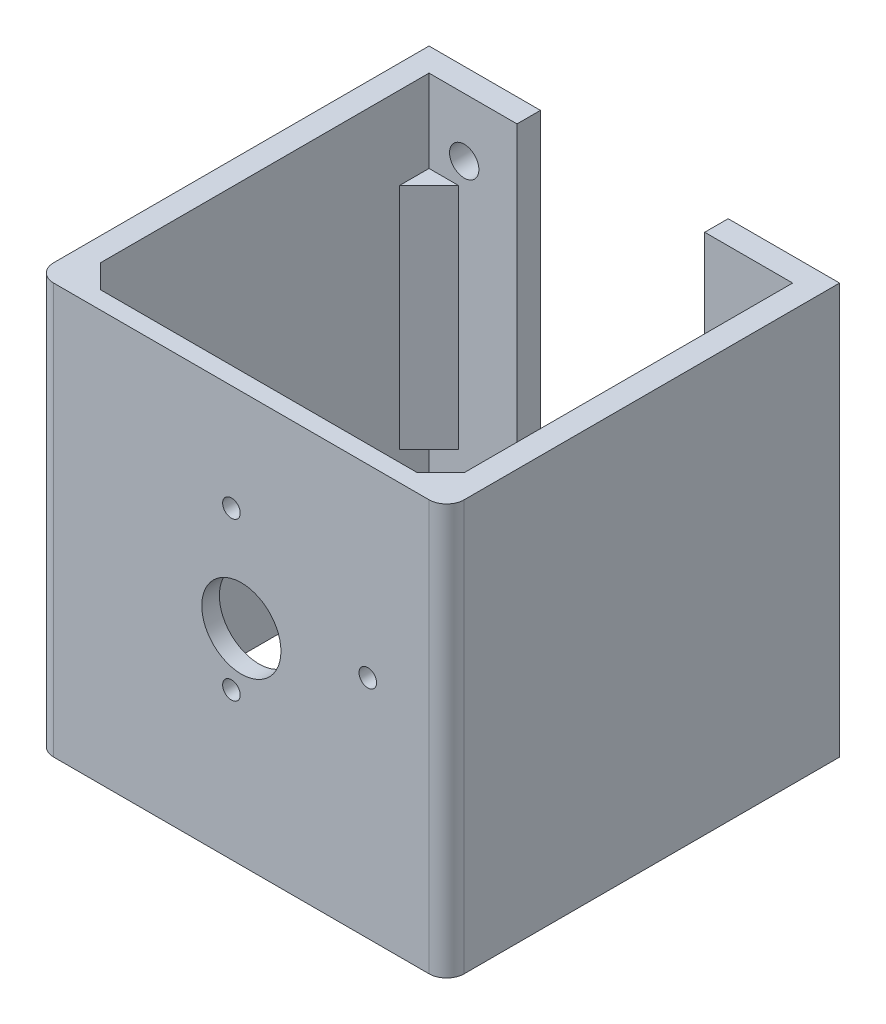
ISO-10303-21;
HEADER;
FILE_DESCRIPTION(('STEP AP214'),'2;1');
FILE_NAME('part.step','',(''),(''),'','','');
FILE_SCHEMA(('AUTOMOTIVE_DESIGN { 1 0 10303 214 1 1 1 1 }'));
ENDSEC;
DATA;
#1=APPLICATION_CONTEXT('core data for automotive mechanical design processes');
#2=APPLICATION_PROTOCOL_DEFINITION('international standard','automotive_design',2000,#1);
#3=PRODUCT_CONTEXT('',#1,'mechanical');
#4=PRODUCT('Part','Part','',(#3));
#5=PRODUCT_RELATED_PRODUCT_CATEGORY('part','',(#4));
#6=PRODUCT_DEFINITION_FORMATION('','',#4);
#7=PRODUCT_DEFINITION_CONTEXT('part definition',#1,'design');
#8=PRODUCT_DEFINITION('design','',#6,#7);
#9=PRODUCT_DEFINITION_SHAPE('','',#8);
#10=(LENGTH_UNIT() NAMED_UNIT(*) SI_UNIT(.MILLI.,.METRE.));
#11=(NAMED_UNIT(*) PLANE_ANGLE_UNIT() SI_UNIT($,.RADIAN.));
#12=(NAMED_UNIT(*) SI_UNIT($,.STERADIAN.) SOLID_ANGLE_UNIT());
#13=UNCERTAINTY_MEASURE_WITH_UNIT(LENGTH_MEASURE(1.E-05),#10,'distance_accuracy_value','');
#14=(GEOMETRIC_REPRESENTATION_CONTEXT(3) GLOBAL_UNCERTAINTY_ASSIGNED_CONTEXT((#13)) GLOBAL_UNIT_ASSIGNED_CONTEXT((#10,
#11,#12)) REPRESENTATION_CONTEXT('',''));
#15=CARTESIAN_POINT('',(0.,0.,0.));
#16=DIRECTION('',(0.,0.,1.));
#17=DIRECTION('',(1.,0.,0.));
#18=AXIS2_PLACEMENT_3D('',#15,#16,#17);
#19=CARTESIAN_POINT('',(21.3942475766725,0.,0.));
#20=DIRECTION('',(-1.,0.,0.));
#21=DIRECTION('',(0.,-1.,0.));
#22=AXIS2_PLACEMENT_3D('',#19,#20,#21);
#23=PLANE('',#22);
#24=DIRECTION('',(0.,1.,0.));
#25=VECTOR('',#24,1.);
#26=CARTESIAN_POINT('',(21.3942475766725,-19.,-55.0000000000001));
#27=LINE('',#26,#25);
#28=CARTESIAN_POINT('',(21.3942475766725,-19.,-55.0000000000001));
#29=VERTEX_POINT('',#28);
#30=CARTESIAN_POINT('',(21.3942475766725,20.,-55.0000000000001));
#31=VERTEX_POINT('',#30);
#32=EDGE_CURVE('E195',#29,#31,#27,.T.);
#33=ORIENTED_EDGE('',*,*,#32,.F.);
#34=DIRECTION('',(0.,0.,-1.));
#35=VECTOR('',#34,1.);
#36=CARTESIAN_POINT('',(21.3942475766725,-19.,-55.0000000000001));
#37=LINE('',#36,#35);
#38=CARTESIAN_POINT('',(21.3942475766725,-19.,-60.));
#39=VERTEX_POINT('',#38);
#40=EDGE_CURVE('E207',#29,#39,#37,.T.);
#41=ORIENTED_EDGE('',*,*,#40,.T.);
#42=DIRECTION('',(0.,-1.,0.));
#43=VECTOR('',#42,1.);
#44=CARTESIAN_POINT('',(21.3942475766725,-35.9180041315748,-60.));
#45=LINE('',#44,#43);
#46=CARTESIAN_POINT('',(21.3942475766725,-35.9180041315748,-60.));
#47=VERTEX_POINT('',#46);
#48=EDGE_CURVE('E306',#39,#47,#45,.T.);
#49=ORIENTED_EDGE('',*,*,#48,.T.);
#50=DIRECTION('',(0.,0.,-1.));
#51=VECTOR('',#50,1.);
#52=CARTESIAN_POINT('',(21.3942475766725,-35.9180041315748,-64.));
#53=LINE('',#52,#51);
#54=CARTESIAN_POINT('',(21.3942475766725,-35.9180041315748,-4.));
#55=VERTEX_POINT('',#54);
#56=EDGE_CURVE('E339',#55,#47,#53,.T.);
#57=ORIENTED_EDGE('',*,*,#56,.F.);
#58=DIRECTION('',(0.,1.,0.));
#59=VECTOR('',#58,1.);
#60=CARTESIAN_POINT('',(21.3942475766725,-35.9180041315748,-4.));
#61=LINE('',#60,#59);
#62=CARTESIAN_POINT('',(21.3942475766725,34.0819958684253,-4.));
#63=VERTEX_POINT('',#62);
#64=EDGE_CURVE('E239',#55,#63,#61,.T.);
#65=ORIENTED_EDGE('',*,*,#64,.T.);
#66=DIRECTION('',(0.,0.,1.));
#67=VECTOR('',#66,1.);
#68=CARTESIAN_POINT('',(21.3942475766725,34.0819958684253,0.));
#69=LINE('',#68,#67);
#70=CARTESIAN_POINT('',(21.3942475766725,34.0819958684253,-60.));
#71=VERTEX_POINT('',#70);
#72=EDGE_CURVE('E342',#71,#63,#69,.T.);
#73=ORIENTED_EDGE('',*,*,#72,.F.);
#74=CARTESIAN_POINT('',(21.3942475766725,20.,-60.));
#75=VERTEX_POINT('',#74);
#76=EDGE_CURVE('E303',#71,#75,#45,.T.);
#77=ORIENTED_EDGE('',*,*,#76,.T.);
#78=DIRECTION('',(0.,0.,-1.));
#79=VECTOR('',#78,1.);
#80=CARTESIAN_POINT('',(21.3942475766725,20.,-55.0000000000001));
#81=LINE('',#80,#79);
#82=EDGE_CURVE('E203',#31,#75,#81,.T.);
#83=ORIENTED_EDGE('',*,*,#82,.F.);
#84=EDGE_LOOP('',(#33,#41,#49,#57,#65,#73,#77,#83));
#85=FACE_BOUND('',#84,.T.);
#86=ADVANCED_FACE('F35',(#85),#23,.T.);
#87=CARTESIAN_POINT('',(0.,0.,-60.));
#88=DIRECTION('',(0.,0.,1.));
#89=DIRECTION('',(1.,0.,0.));
#90=AXIS2_PLACEMENT_3D('',#87,#88,#89);
#91=PLANE('',#90);
#92=CARTESIAN_POINT('',(15.3942475766725,-25.9180041315748,-60.));
#93=DIRECTION('',(0.,0.,-1.));
#94=DIRECTION('',(-1.,0.,0.));
#95=AXIS2_PLACEMENT_3D('',#92,#93,#94);
#96=CIRCLE('',#95,2.5);
#97=CARTESIAN_POINT('',(12.8942475766725,-25.9180041315748,-60.));
#98=VERTEX_POINT('',#97);
#99=EDGE_CURVE('E263',#98,#98,#96,.T.);
#100=ORIENTED_EDGE('',*,*,#99,.T.);
#101=EDGE_LOOP('',(#100));
#102=FACE_BOUND('',#101,.T.);
#103=CARTESIAN_POINT('',(15.3942475766725,24.0819958684252,-60.));
#104=DIRECTION('',(0.,0.,-1.));
#105=DIRECTION('',(-1.,0.,0.));
#106=AXIS2_PLACEMENT_3D('',#103,#104,#105);
#107=CIRCLE('',#106,2.5);
#108=CARTESIAN_POINT('',(12.8942475766725,24.0819958684252,-60.));
#109=VERTEX_POINT('',#108);
#110=EDGE_CURVE('E275',#109,#109,#107,.T.);
#111=ORIENTED_EDGE('',*,*,#110,.T.);
#112=EDGE_LOOP('',(#111));
#113=FACE_BOUND('',#112,.T.);
#114=ORIENTED_EDGE('',*,*,#48,.F.);
#115=DIRECTION('',(-1.,0.,0.));
#116=VECTOR('',#115,1.);
#117=CARTESIAN_POINT('',(21.3942475766725,-19.,-60.));
#118=LINE('',#117,#116);
#119=CARTESIAN_POINT('',(16.3942475766725,-19.,-60.));
#120=VERTEX_POINT('',#119);
#121=EDGE_CURVE('E190',#39,#120,#118,.T.);
#122=ORIENTED_EDGE('',*,*,#121,.T.);
#123=DIRECTION('',(0.,1.,0.));
#124=VECTOR('',#123,1.);
#125=CARTESIAN_POINT('',(16.3942475766725,-19.,-60.));
#126=LINE('',#125,#124);
#127=CARTESIAN_POINT('',(16.3942475766725,20.,-60.));
#128=VERTEX_POINT('',#127);
#129=EDGE_CURVE('E183',#120,#128,#126,.T.);
#130=ORIENTED_EDGE('',*,*,#129,.T.);
#131=DIRECTION('',(-1.,0.,0.));
#132=VECTOR('',#131,1.);
#133=CARTESIAN_POINT('',(21.3942475766725,20.,-60.));
#134=LINE('',#133,#132);
#135=EDGE_CURVE('E187',#75,#128,#134,.T.);
#136=ORIENTED_EDGE('',*,*,#135,.F.);
#137=ORIENTED_EDGE('',*,*,#76,.F.);
#138=DIRECTION('',(1.,0.,0.));
#139=VECTOR('',#138,1.);
#140=CARTESIAN_POINT('',(21.3942475766725,34.0819958684253,-60.));
#141=LINE('',#140,#139);
#142=CARTESIAN_POINT('',(6.39424757667248,34.0819958684253,-60.));
#143=VERTEX_POINT('',#142);
#144=EDGE_CURVE('E312',#143,#71,#141,.T.);
#145=ORIENTED_EDGE('',*,*,#144,.F.);
#146=DIRECTION('',(0.,1.,0.));
#147=VECTOR('',#146,1.);
#148=CARTESIAN_POINT('',(6.39424757667248,34.0819958684253,-60.));
#149=LINE('',#148,#147);
#150=CARTESIAN_POINT('',(6.39424757667248,-35.9180041315748,-60.));
#151=VERTEX_POINT('',#150);
#152=EDGE_CURVE('E309',#151,#143,#149,.T.);
#153=ORIENTED_EDGE('',*,*,#152,.F.);
#154=DIRECTION('',(-1.,0.,0.));
#155=VECTOR('',#154,1.);
#156=CARTESIAN_POINT('',(6.39424757667248,-35.9180041315748,-60.));
#157=LINE('',#156,#155);
#158=EDGE_CURVE('E305',#47,#151,#157,.T.);
#159=ORIENTED_EDGE('',*,*,#158,.F.);
#160=EDGE_LOOP('',(#114,#122,#130,#136,#137,#145,#153,#159));
#161=FACE_BOUND('',#160,.T.);
#162=ADVANCED_FACE('F186',(#102,#113,#161),#91,.T.);
#163=CARTESIAN_POINT('',(-40.6057524233275,0.,0.));
#164=DIRECTION('',(-1.,0.,0.));
#165=DIRECTION('',(0.,-1.,0.));
#166=AXIS2_PLACEMENT_3D('',#163,#164,#165);
#167=PLANE('',#166);
#168=DIRECTION('',(0.,1.,0.));
#169=VECTOR('',#168,1.);
#170=CARTESIAN_POINT('',(-40.6057524233275,-35.9180041315748,-60.));
#171=LINE('',#170,#169);
#172=CARTESIAN_POINT('',(-40.6057524233275,-35.9180041315748,-60.));
#173=VERTEX_POINT('',#172);
#174=CARTESIAN_POINT('',(-40.6057524233275,-19.,-60.));
#175=VERTEX_POINT('',#174);
#176=EDGE_CURVE('E281',#173,#175,#171,.T.);
#177=ORIENTED_EDGE('',*,*,#176,.T.);
#178=DIRECTION('',(0.,0.,1.));
#179=VECTOR('',#178,1.);
#180=CARTESIAN_POINT('',(-40.6057524233275,-19.,-54.9999999999999));
#181=LINE('',#180,#179);
#182=CARTESIAN_POINT('',(-40.6057524233275,-19.,-54.9999999999999));
#183=VERTEX_POINT('',#182);
#184=EDGE_CURVE('E224',#175,#183,#181,.T.);
#185=ORIENTED_EDGE('',*,*,#184,.T.);
#186=DIRECTION('',(0.,1.,0.));
#187=VECTOR('',#186,1.);
#188=CARTESIAN_POINT('',(-40.6057524233275,-19.,-54.9999999999999));
#189=LINE('',#188,#187);
#190=CARTESIAN_POINT('',(-40.6057524233275,20.,-54.9999999999999));
#191=VERTEX_POINT('',#190);
#192=EDGE_CURVE('E231',#183,#191,#189,.T.);
#193=ORIENTED_EDGE('',*,*,#192,.T.);
#194=DIRECTION('',(0.,0.,1.));
#195=VECTOR('',#194,1.);
#196=CARTESIAN_POINT('',(-40.6057524233275,20.,-54.9999999999999));
#197=LINE('',#196,#195);
#198=CARTESIAN_POINT('',(-40.6057524233275,20.,-60.));
#199=VERTEX_POINT('',#198);
#200=EDGE_CURVE('E214',#199,#191,#197,.T.);
#201=ORIENTED_EDGE('',*,*,#200,.F.);
#202=CARTESIAN_POINT('',(-40.6057524233275,34.0819958684252,-60.));
#203=VERTEX_POINT('',#202);
#204=EDGE_CURVE('E285',#199,#203,#171,.T.);
#205=ORIENTED_EDGE('',*,*,#204,.T.);
#206=DIRECTION('',(0.,0.,-1.));
#207=VECTOR('',#206,1.);
#208=CARTESIAN_POINT('',(-40.6057524233275,34.0819958684253,0.));
#209=LINE('',#208,#207);
#210=CARTESIAN_POINT('',(-40.6057524233275,34.0819958684253,-4.));
#211=VERTEX_POINT('',#210);
#212=EDGE_CURVE('E324',#211,#203,#209,.T.);
#213=ORIENTED_EDGE('',*,*,#212,.F.);
#214=DIRECTION('',(0.,1.,0.));
#215=VECTOR('',#214,1.);
#216=CARTESIAN_POINT('',(-40.6057524233275,-35.9180041315748,-4.));
#217=LINE('',#216,#215);
#218=CARTESIAN_POINT('',(-40.6057524233275,-35.9180041315748,-4.));
#219=VERTEX_POINT('',#218);
#220=EDGE_CURVE('E251',#219,#211,#217,.T.);
#221=ORIENTED_EDGE('',*,*,#220,.F.);
#222=DIRECTION('',(0.,0.,1.));
#223=VECTOR('',#222,1.);
#224=CARTESIAN_POINT('',(-40.6057524233275,-35.9180041315748,-64.));
#225=LINE('',#224,#223);
#226=EDGE_CURVE('E327',#173,#219,#225,.T.);
#227=ORIENTED_EDGE('',*,*,#226,.F.);
#228=EDGE_LOOP('',(#177,#185,#193,#201,#205,#213,#221,#227));
#229=FACE_BOUND('',#228,.T.);
#230=ADVANCED_FACE('F447',(#229),#167,.F.);
#231=CARTESIAN_POINT('',(0.,0.,0.));
#232=DIRECTION('',(0.,0.,1.));
#233=DIRECTION('',(1.,0.,0.));
#234=AXIS2_PLACEMENT_3D('',#231,#232,#233);
#235=PLANE('',#234);
#236=CARTESIAN_POINT('',(-9.6057524233275,-0.918004131574765,0.));
#237=DIRECTION('',(0.,0.,1.));
#238=DIRECTION('',(1.,0.,0.));
#239=AXIS2_PLACEMENT_3D('',#236,#237,#238);
#240=CIRCLE('',#239,6.75);
#241=CARTESIAN_POINT('',(-2.8557524233275,-0.918004131574765,0.));
#242=VERTEX_POINT('',#241);
#243=EDGE_CURVE('E365',#242,#242,#240,.T.);
#244=ORIENTED_EDGE('',*,*,#243,.T.);
#245=EDGE_LOOP('',(#244));
#246=FACE_BOUND('',#245,.T.);
#247=CARTESIAN_POINT('',(-11.2935745968364,16.005389627084,0.));
#248=DIRECTION('',(0.,0.,1.));
#249=DIRECTION('',(1.,0.,0.));
#250=AXIS2_PLACEMENT_3D('',#247,#248,#249);
#251=CIRCLE('',#250,1.5);
#252=CARTESIAN_POINT('',(-9.79357459683639,16.005389627084,0.));
#253=VERTEX_POINT('',#252);
#254=EDGE_CURVE('E389',#253,#253,#251,.T.);
#255=ORIENTED_EDGE('',*,*,#254,.T.);
#256=EDGE_LOOP('',(#255));
#257=FACE_BOUND('',#256,.T.);
#258=CARTESIAN_POINT('',(11.9564254031636,2.5819958684252,0.));
#259=DIRECTION('',(0.,0.,1.));
#260=DIRECTION('',(1.,0.,0.));
#261=AXIS2_PLACEMENT_3D('',#258,#259,#260);
#262=CIRCLE('',#261,1.5);
#263=CARTESIAN_POINT('',(13.4564254031636,2.5819958684252,0.));
#264=VERTEX_POINT('',#263);
#265=EDGE_CURVE('E392',#264,#264,#262,.T.);
#266=ORIENTED_EDGE('',*,*,#265,.T.);
#267=EDGE_LOOP('',(#266));
#268=FACE_BOUND('',#267,.T.);
#269=CARTESIAN_POINT('',(-11.2935745968364,-10.8413978902336,0.));
#270=DIRECTION('',(0.,0.,1.));
#271=DIRECTION('',(1.,0.,0.));
#272=AXIS2_PLACEMENT_3D('',#269,#270,#271);
#273=CIRCLE('',#272,1.5);
#274=CARTESIAN_POINT('',(-9.79357459683645,-10.8413978902336,0.));
#275=VERTEX_POINT('',#274);
#276=EDGE_CURVE('E377',#275,#275,#273,.T.);
#277=ORIENTED_EDGE('',*,*,#276,.T.);
#278=EDGE_LOOP('',(#277));
#279=FACE_BOUND('',#278,.T.);
#280=DIRECTION('',(-1.,0.,0.));
#281=VECTOR('',#280,1.);
#282=CARTESIAN_POINT('',(-44.6057524233275,34.0819958684253,0.));
#283=LINE('',#282,#281);
#284=CARTESIAN_POINT('',(17.3942475766725,34.0819958684253,0.));
#285=VERTEX_POINT('',#284);
#286=CARTESIAN_POINT('',(-36.6057524233275,34.0819958684253,0.));
#287=VERTEX_POINT('',#286);
#288=EDGE_CURVE('E370',#285,#287,#283,.T.);
#289=ORIENTED_EDGE('',*,*,#288,.F.);
#290=DIRECTION('',(0.,1.,0.));
#291=VECTOR('',#290,1.);
#292=CARTESIAN_POINT('',(17.3942475766725,-35.9180041315748,0.));
#293=LINE('',#292,#291);
#294=CARTESIAN_POINT('',(17.3942475766725,-35.9180041315748,0.));
#295=VERTEX_POINT('',#294);
#296=EDGE_CURVE('E242',#295,#285,#293,.T.);
#297=ORIENTED_EDGE('',*,*,#296,.F.);
#298=DIRECTION('',(1.,0.,0.));
#299=VECTOR('',#298,1.);
#300=CARTESIAN_POINT('',(-44.6057524233275,-35.9180041315748,0.));
#301=LINE('',#300,#299);
#302=CARTESIAN_POINT('',(-36.6057524233275,-35.9180041315748,0.));
#303=VERTEX_POINT('',#302);
#304=EDGE_CURVE('E374',#303,#295,#301,.T.);
#305=ORIENTED_EDGE('',*,*,#304,.F.);
#306=DIRECTION('',(0.,1.,0.));
#307=VECTOR('',#306,1.);
#308=CARTESIAN_POINT('',(-36.6057524233275,-35.9180041315748,0.));
#309=LINE('',#308,#307);
#310=EDGE_CURVE('E249',#303,#287,#309,.T.);
#311=ORIENTED_EDGE('',*,*,#310,.T.);
#312=EDGE_LOOP('',(#289,#297,#305,#311));
#313=FACE_BOUND('',#312,.T.);
#314=ADVANCED_FACE('F439',(#246,#257,#268,#279,#313),#235,.F.);
#315=CARTESIAN_POINT('',(-44.6057524233275,34.0819958684253,3.));
#316=DIRECTION('',(1.,0.,0.));
#317=DIRECTION('',(0.,1.,0.));
#318=AXIS2_PLACEMENT_3D('',#315,#316,#317);
#319=PLANE('',#318);
#320=DIRECTION('',(0.,0.,-1.));
#321=VECTOR('',#320,1.);
#322=CARTESIAN_POINT('',(-44.6057524233275,-35.9180041315748,3.));
#323=LINE('',#322,#321);
#324=CARTESIAN_POINT('',(-44.6057524233275,-35.9180041315748,0.));
#325=VERTEX_POINT('',#324);
#326=CARTESIAN_POINT('',(-44.6057524233275,-35.9180041315748,-64.));
#327=VERTEX_POINT('',#326);
#328=EDGE_CURVE('E384',#325,#327,#323,.T.);
#329=ORIENTED_EDGE('',*,*,#328,.F.);
#330=DIRECTION('',(0.,-1.,0.));
#331=VECTOR('',#330,1.);
#332=CARTESIAN_POINT('',(-44.6057524233275,34.0819958684253,0.));
#333=LINE('',#332,#331);
#334=CARTESIAN_POINT('',(-44.6057524233275,34.0819958684253,0.));
#335=VERTEX_POINT('',#334);
#336=EDGE_CURVE('E11',#325,#335,#333,.F.);
#337=ORIENTED_EDGE('',*,*,#336,.T.);
#338=DIRECTION('',(0.,0.,-1.));
#339=VECTOR('',#338,1.);
#340=CARTESIAN_POINT('',(-44.6057524233275,34.0819958684253,3.));
#341=LINE('',#340,#339);
#342=CARTESIAN_POINT('',(-44.6057524233275,34.0819958684252,-64.));
#343=VERTEX_POINT('',#342);
#344=EDGE_CURVE('E373',#335,#343,#341,.T.);
#345=ORIENTED_EDGE('',*,*,#344,.T.);
#346=DIRECTION('',(0.,-1.,0.));
#347=VECTOR('',#346,1.);
#348=CARTESIAN_POINT('',(-44.6057524233275,34.0819958684252,-64.));
#349=LINE('',#348,#347);
#350=EDGE_CURVE('E321',#343,#327,#349,.T.);
#351=ORIENTED_EDGE('',*,*,#350,.T.);
#352=EDGE_LOOP('',(#329,#337,#345,#351));
#353=FACE_BOUND('',#352,.T.);
#354=ADVANCED_FACE('F463',(#353),#319,.F.);
#355=CARTESIAN_POINT('',(-44.6057524233275,-35.9180041315748,3.));
#356=DIRECTION('',(0.,1.,0.));
#357=DIRECTION('',(0.,0.,1.));
#358=AXIS2_PLACEMENT_3D('',#355,#356,#357);
#359=PLANE('',#358);
#360=DIRECTION('',(0.,0.,-1.));
#361=VECTOR('',#360,1.);
#362=CARTESIAN_POINT('',(25.3942475766725,-35.9180041315748,3.));
#363=LINE('',#362,#361);
#364=CARTESIAN_POINT('',(25.3942475766725,-35.9180041315748,0.));
#365=VERTEX_POINT('',#364);
#366=CARTESIAN_POINT('',(25.3942475766725,-35.9180041315748,-64.));
#367=VERTEX_POINT('',#366);
#368=EDGE_CURVE('E382',#365,#367,#363,.T.);
#369=ORIENTED_EDGE('',*,*,#368,.F.);
#370=CARTESIAN_POINT('',(22.3942475766725,-35.9180041315748,0.));
#371=DIRECTION('',(0.,1.,0.));
#372=DIRECTION('',(0.,0.,1.));
#373=AXIS2_PLACEMENT_3D('',#370,#371,#372);
#374=CIRCLE('',#373,3.);
#375=CARTESIAN_POINT('',(22.3942475766725,-35.9180041315748,3.));
#376=VERTEX_POINT('',#375);
#377=EDGE_CURVE('E43',#365,#376,#374,.F.);
#378=ORIENTED_EDGE('',*,*,#377,.T.);
#379=DIRECTION('',(1.,0.,0.));
#380=VECTOR('',#379,1.);
#381=CARTESIAN_POINT('',(-44.6057524233275,-35.9180041315748,3.));
#382=LINE('',#381,#380);
#383=CARTESIAN_POINT('',(-41.6057524233275,-35.9180041315748,3.));
#384=VERTEX_POINT('',#383);
#385=EDGE_CURVE('E366',#384,#376,#382,.T.);
#386=ORIENTED_EDGE('',*,*,#385,.F.);
#387=CARTESIAN_POINT('',(-41.6057524233275,-35.9180041315748,0.));
#388=DIRECTION('',(0.,1.,0.));
#389=DIRECTION('',(0.,0.,1.));
#390=AXIS2_PLACEMENT_3D('',#387,#388,#389);
#391=CIRCLE('',#390,3.);
#392=EDGE_CURVE('E50',#384,#325,#391,.F.);
#393=ORIENTED_EDGE('',*,*,#392,.T.);
#394=ORIENTED_EDGE('',*,*,#328,.T.);
#395=DIRECTION('',(-1.,0.,0.));
#396=VECTOR('',#395,1.);
#397=CARTESIAN_POINT('',(-40.6057524233275,-35.9180041315748,-64.));
#398=LINE('',#397,#396);
#399=CARTESIAN_POINT('',(-25.6057524233275,-35.9180041315748,-64.));
#400=VERTEX_POINT('',#399);
#401=EDGE_CURVE('E333',#400,#327,#398,.T.);
#402=ORIENTED_EDGE('',*,*,#401,.F.);
#403=DIRECTION('',(0.,0.,-1.));
#404=VECTOR('',#403,1.);
#405=CARTESIAN_POINT('',(-25.6057524233275,-35.9180041315748,-60.));
#406=LINE('',#405,#404);
#407=CARTESIAN_POINT('',(-25.6057524233275,-35.9180041315748,-60.));
#408=VERTEX_POINT('',#407);
#409=EDGE_CURVE('E297',#408,#400,#406,.T.);
#410=ORIENTED_EDGE('',*,*,#409,.F.);
#411=DIRECTION('',(-1.,0.,0.));
#412=VECTOR('',#411,1.);
#413=CARTESIAN_POINT('',(-25.6057524233275,-35.9180041315748,-60.));
#414=LINE('',#413,#412);
#415=EDGE_CURVE('E291',#408,#173,#414,.T.);
#416=ORIENTED_EDGE('',*,*,#415,.T.);
#417=ORIENTED_EDGE('',*,*,#226,.T.);
#418=DIRECTION('',(-0.707106781186548,0.,-0.707106781186547));
#419=VECTOR('',#418,1.);
#420=CARTESIAN_POINT('',(-40.6057524233275,-35.9180041315748,-4.));
#421=LINE('',#420,#419);
#422=EDGE_CURVE('E247',#303,#219,#421,.T.);
#423=ORIENTED_EDGE('',*,*,#422,.F.);
#424=ORIENTED_EDGE('',*,*,#304,.T.);
#425=DIRECTION('',(-0.707106781186547,0.,0.707106781186548));
#426=VECTOR('',#425,1.);
#427=CARTESIAN_POINT('',(21.3942475766725,-35.9180041315748,-4.));
#428=LINE('',#427,#426);
#429=EDGE_CURVE('E237',#55,#295,#428,.T.);
#430=ORIENTED_EDGE('',*,*,#429,.F.);
#431=ORIENTED_EDGE('',*,*,#56,.T.);
#432=ORIENTED_EDGE('',*,*,#158,.T.);
#433=DIRECTION('',(0.,0.,-1.));
#434=VECTOR('',#433,1.);
#435=CARTESIAN_POINT('',(6.39424757667248,-35.9180041315748,-60.));
#436=LINE('',#435,#434);
#437=CARTESIAN_POINT('',(6.39424757667248,-35.9180041315748,-64.));
#438=VERTEX_POINT('',#437);
#439=EDGE_CURVE('E315',#151,#438,#436,.T.);
#440=ORIENTED_EDGE('',*,*,#439,.T.);
#441=DIRECTION('',(1.,0.,0.));
#442=VECTOR('',#441,1.);
#443=CARTESIAN_POINT('',(21.3942475766725,-35.9180041315748,-64.));
#444=LINE('',#443,#442);
#445=EDGE_CURVE('E345',#438,#367,#444,.T.);
#446=ORIENTED_EDGE('',*,*,#445,.T.);
#447=EDGE_LOOP('',(#369,#378,#386,#393,#394,#402,#410,#416,#417,#423,#424,#430,#431,#432,#440,#446));
#448=FACE_BOUND('',#447,.T.);
#449=ADVANCED_FACE('F408',(#448),#359,.F.);
#450=CARTESIAN_POINT('',(25.3942475766725,34.0819958684253,3.));
#451=DIRECTION('',(-1.,0.,0.));
#452=DIRECTION('',(0.,-1.,0.));
#453=AXIS2_PLACEMENT_3D('',#450,#451,#452);
#454=PLANE('',#453);
#455=DIRECTION('',(0.,0.,-1.));
#456=VECTOR('',#455,1.);
#457=CARTESIAN_POINT('',(25.3942475766725,34.0819958684253,3.));
#458=LINE('',#457,#456);
#459=CARTESIAN_POINT('',(25.3942475766725,34.0819958684253,0.));
#460=VERTEX_POINT('',#459);
#461=CARTESIAN_POINT('',(25.3942475766725,34.0819958684253,-64.));
#462=VERTEX_POINT('',#461);
#463=EDGE_CURVE('E380',#460,#462,#458,.T.);
#464=ORIENTED_EDGE('',*,*,#463,.F.);
#465=DIRECTION('',(0.,1.,0.));
#466=VECTOR('',#465,1.);
#467=CARTESIAN_POINT('',(25.3942475766725,-35.9180041315748,0.));
#468=LINE('',#467,#466);
#469=EDGE_CURVE('E58',#460,#365,#468,.F.);
#470=ORIENTED_EDGE('',*,*,#469,.T.);
#471=ORIENTED_EDGE('',*,*,#368,.T.);
#472=DIRECTION('',(0.,1.,0.));
#473=VECTOR('',#472,1.);
#474=CARTESIAN_POINT('',(25.3942475766725,34.0819958684253,-64.));
#475=LINE('',#474,#473);
#476=EDGE_CURVE('E336',#367,#462,#475,.T.);
#477=ORIENTED_EDGE('',*,*,#476,.T.);
#478=EDGE_LOOP('',(#464,#470,#471,#477));
#479=FACE_BOUND('',#478,.T.);
#480=ADVANCED_FACE('F418',(#479),#454,.F.);
#481=CARTESIAN_POINT('',(-44.6057524233275,34.0819958684253,3.));
#482=DIRECTION('',(0.,-1.,0.));
#483=DIRECTION('',(0.,0.,-1.));
#484=AXIS2_PLACEMENT_3D('',#481,#482,#483);
#485=PLANE('',#484);
#486=DIRECTION('',(-1.,0.,0.));
#487=VECTOR('',#486,1.);
#488=CARTESIAN_POINT('',(-44.6057524233275,34.0819958684253,3.));
#489=LINE('',#488,#487);
#490=CARTESIAN_POINT('',(22.3942475766725,34.0819958684253,3.));
#491=VERTEX_POINT('',#490);
#492=CARTESIAN_POINT('',(-41.6057524233275,34.0819958684253,3.));
#493=VERTEX_POINT('',#492);
#494=EDGE_CURVE('E369',#491,#493,#489,.T.);
#495=ORIENTED_EDGE('',*,*,#494,.F.);
#496=CARTESIAN_POINT('',(22.3942475766725,34.0819958684253,0.));
#497=DIRECTION('',(0.,-1.,0.));
#498=DIRECTION('',(0.,0.,-1.));
#499=AXIS2_PLACEMENT_3D('',#496,#497,#498);
#500=CIRCLE('',#499,3.);
#501=EDGE_CURVE('E404',#491,#460,#500,.F.);
#502=ORIENTED_EDGE('',*,*,#501,.T.);
#503=ORIENTED_EDGE('',*,*,#463,.T.);
#504=DIRECTION('',(1.,0.,0.));
#505=VECTOR('',#504,1.);
#506=CARTESIAN_POINT('',(21.3942475766725,34.0819958684253,-64.));
#507=LINE('',#506,#505);
#508=CARTESIAN_POINT('',(6.39424757667248,34.0819958684253,-64.));
#509=VERTEX_POINT('',#508);
#510=EDGE_CURVE('E348',#509,#462,#507,.T.);
#511=ORIENTED_EDGE('',*,*,#510,.F.);
#512=DIRECTION('',(0.,0.,-1.));
#513=VECTOR('',#512,1.);
#514=CARTESIAN_POINT('',(6.39424757667248,34.0819958684253,-60.));
#515=LINE('',#514,#513);
#516=EDGE_CURVE('E318',#143,#509,#515,.T.);
#517=ORIENTED_EDGE('',*,*,#516,.F.);
#518=ORIENTED_EDGE('',*,*,#144,.T.);
#519=ORIENTED_EDGE('',*,*,#72,.T.);
#520=DIRECTION('',(-0.707106781186547,0.,0.707106781186548));
#521=VECTOR('',#520,1.);
#522=CARTESIAN_POINT('',(21.3942475766725,34.0819958684253,-4.));
#523=LINE('',#522,#521);
#524=EDGE_CURVE('E235',#63,#285,#523,.T.);
#525=ORIENTED_EDGE('',*,*,#524,.T.);
#526=ORIENTED_EDGE('',*,*,#288,.T.);
#527=DIRECTION('',(-0.707106781186548,0.,-0.707106781186547));
#528=VECTOR('',#527,1.);
#529=CARTESIAN_POINT('',(-40.6057524233275,34.0819958684253,-4.));
#530=LINE('',#529,#528);
#531=EDGE_CURVE('E244',#287,#211,#530,.T.);
#532=ORIENTED_EDGE('',*,*,#531,.T.);
#533=ORIENTED_EDGE('',*,*,#212,.T.);
#534=DIRECTION('',(1.,0.,0.));
#535=VECTOR('',#534,1.);
#536=CARTESIAN_POINT('',(-40.6057524233275,34.0819958684252,-60.));
#537=LINE('',#536,#535);
#538=CARTESIAN_POINT('',(-25.6057524233275,34.0819958684253,-60.));
#539=VERTEX_POINT('',#538);
#540=EDGE_CURVE('E284',#203,#539,#537,.T.);
#541=ORIENTED_EDGE('',*,*,#540,.T.);
#542=DIRECTION('',(0.,0.,-1.));
#543=VECTOR('',#542,1.);
#544=CARTESIAN_POINT('',(-25.6057524233275,34.0819958684253,-60.));
#545=LINE('',#544,#543);
#546=CARTESIAN_POINT('',(-25.6057524233275,34.0819958684253,-64.));
#547=VERTEX_POINT('',#546);
#548=EDGE_CURVE('E294',#539,#547,#545,.T.);
#549=ORIENTED_EDGE('',*,*,#548,.T.);
#550=DIRECTION('',(-1.,0.,0.));
#551=VECTOR('',#550,1.);
#552=CARTESIAN_POINT('',(-40.6057524233275,34.0819958684252,-64.));
#553=LINE('',#552,#551);
#554=EDGE_CURVE('E330',#547,#343,#553,.T.);
#555=ORIENTED_EDGE('',*,*,#554,.T.);
#556=ORIENTED_EDGE('',*,*,#344,.F.);
#557=CARTESIAN_POINT('',(-41.6057524233275,34.0819958684253,0.));
#558=DIRECTION('',(0.,-1.,0.));
#559=DIRECTION('',(0.,0.,-1.));
#560=AXIS2_PLACEMENT_3D('',#557,#558,#559);
#561=CIRCLE('',#560,3.);
#562=EDGE_CURVE('E402',#335,#493,#561,.F.);
#563=ORIENTED_EDGE('',*,*,#562,.T.);
#564=EDGE_LOOP('',(#495,#502,#503,#511,#517,#518,#519,#525,#526,#532,#533,#541,#549,#555,#556,#563));
#565=FACE_BOUND('',#564,.T.);
#566=ADVANCED_FACE('F417',(#565),#485,.F.);
#567=CARTESIAN_POINT('',(0.,0.,3.));
#568=DIRECTION('',(0.,0.,1.));
#569=DIRECTION('',(1.,0.,0.));
#570=AXIS2_PLACEMENT_3D('',#567,#568,#569);
#571=PLANE('',#570);
#572=CARTESIAN_POINT('',(-11.2935745968364,-10.8413978902336,3.));
#573=DIRECTION('',(0.,0.,1.));
#574=DIRECTION('',(1.,0.,0.));
#575=AXIS2_PLACEMENT_3D('',#572,#573,#574);
#576=CIRCLE('',#575,1.5);
#577=CARTESIAN_POINT('',(-9.79357459683645,-10.8413978902336,3.));
#578=VERTEX_POINT('',#577);
#579=EDGE_CURVE('E351',#578,#578,#576,.T.);
#580=ORIENTED_EDGE('',*,*,#579,.F.);
#581=EDGE_LOOP('',(#580));
#582=FACE_BOUND('',#581,.T.);
#583=CARTESIAN_POINT('',(11.9564254031636,2.5819958684252,3.));
#584=DIRECTION('',(0.,0.,1.));
#585=DIRECTION('',(1.,0.,0.));
#586=AXIS2_PLACEMENT_3D('',#583,#584,#585);
#587=CIRCLE('',#586,1.5);
#588=CARTESIAN_POINT('',(13.4564254031636,2.5819958684252,3.));
#589=VERTEX_POINT('',#588);
#590=EDGE_CURVE('E358',#589,#589,#587,.T.);
#591=ORIENTED_EDGE('',*,*,#590,.F.);
#592=EDGE_LOOP('',(#591));
#593=FACE_BOUND('',#592,.T.);
#594=CARTESIAN_POINT('',(-11.2935745968364,16.005389627084,3.));
#595=DIRECTION('',(0.,0.,1.));
#596=DIRECTION('',(1.,0.,0.));
#597=AXIS2_PLACEMENT_3D('',#594,#595,#596);
#598=CIRCLE('',#597,1.5);
#599=CARTESIAN_POINT('',(-9.79357459683639,16.005389627084,3.));
#600=VERTEX_POINT('',#599);
#601=EDGE_CURVE('E354',#600,#600,#598,.T.);
#602=ORIENTED_EDGE('',*,*,#601,.F.);
#603=EDGE_LOOP('',(#602));
#604=FACE_BOUND('',#603,.T.);
#605=CARTESIAN_POINT('',(-9.6057524233275,-0.918004131574765,3.));
#606=DIRECTION('',(0.,0.,1.));
#607=DIRECTION('',(1.,0.,0.));
#608=AXIS2_PLACEMENT_3D('',#605,#606,#607);
#609=CIRCLE('',#608,6.75);
#610=CARTESIAN_POINT('',(-2.8557524233275,-0.918004131574765,3.));
#611=VERTEX_POINT('',#610);
#612=EDGE_CURVE('E357',#611,#611,#609,.T.);
#613=ORIENTED_EDGE('',*,*,#612,.F.);
#614=EDGE_LOOP('',(#613));
#615=FACE_BOUND('',#614,.T.);
#616=ORIENTED_EDGE('',*,*,#385,.T.);
#617=DIRECTION('',(0.,1.,0.));
#618=VECTOR('',#617,1.);
#619=CARTESIAN_POINT('',(22.3942475766725,34.0819958684253,3.));
#620=LINE('',#619,#618);
#621=EDGE_CURVE('E399',#376,#491,#620,.T.);
#622=ORIENTED_EDGE('',*,*,#621,.T.);
#623=ORIENTED_EDGE('',*,*,#494,.T.);
#624=DIRECTION('',(0.,-1.,0.));
#625=VECTOR('',#624,1.);
#626=CARTESIAN_POINT('',(-41.6057524233275,-35.9180041315748,3.));
#627=LINE('',#626,#625);
#628=EDGE_CURVE('E386',#493,#384,#627,.T.);
#629=ORIENTED_EDGE('',*,*,#628,.T.);
#630=EDGE_LOOP('',(#616,#622,#623,#629));
#631=FACE_BOUND('',#630,.T.);
#632=ADVANCED_FACE('F412',(#582,#593,#604,#615,#631),#571,.T.);
#633=CARTESIAN_POINT('',(-9.6057524233275,-0.918004131574765,-1.));
#634=DIRECTION('',(0.,0.,1.));
#635=DIRECTION('',(1.,0.,0.));
#636=AXIS2_PLACEMENT_3D('',#633,#634,#635);
#637=CYLINDRICAL_SURFACE('',#636,6.75);
#638=ORIENTED_EDGE('',*,*,#612,.T.);
#639=EDGE_LOOP('',(#638));
#640=FACE_BOUND('',#639,.T.);
#641=ORIENTED_EDGE('',*,*,#243,.F.);
#642=EDGE_LOOP('',(#641));
#643=FACE_BOUND('',#642,.T.);
#644=ADVANCED_FACE('F488',(#640,#643),#637,.F.);
#645=CARTESIAN_POINT('',(-11.2935745968364,16.005389627084,-1.));
#646=DIRECTION('',(0.,0.,1.));
#647=DIRECTION('',(1.,0.,0.));
#648=AXIS2_PLACEMENT_3D('',#645,#646,#647);
#649=CYLINDRICAL_SURFACE('',#648,1.5);
#650=ORIENTED_EDGE('',*,*,#601,.T.);
#651=EDGE_LOOP('',(#650));
#652=FACE_BOUND('',#651,.T.);
#653=ORIENTED_EDGE('',*,*,#254,.F.);
#654=EDGE_LOOP('',(#653));
#655=FACE_BOUND('',#654,.T.);
#656=ADVANCED_FACE('F484',(#652,#655),#649,.F.);
#657=CARTESIAN_POINT('',(11.9564254031636,2.5819958684252,-1.));
#658=DIRECTION('',(0.,0.,1.));
#659=DIRECTION('',(1.,0.,0.));
#660=AXIS2_PLACEMENT_3D('',#657,#658,#659);
#661=CYLINDRICAL_SURFACE('',#660,1.5);
#662=ORIENTED_EDGE('',*,*,#590,.T.);
#663=EDGE_LOOP('',(#662));
#664=FACE_BOUND('',#663,.T.);
#665=ORIENTED_EDGE('',*,*,#265,.F.);
#666=EDGE_LOOP('',(#665));
#667=FACE_BOUND('',#666,.T.);
#668=ADVANCED_FACE('F487',(#664,#667),#661,.F.);
#669=CARTESIAN_POINT('',(-11.2935745968364,-10.8413978902336,-1.));
#670=DIRECTION('',(0.,0.,1.));
#671=DIRECTION('',(1.,0.,0.));
#672=AXIS2_PLACEMENT_3D('',#669,#670,#671);
#673=CYLINDRICAL_SURFACE('',#672,1.5);
#674=ORIENTED_EDGE('',*,*,#579,.T.);
#675=EDGE_LOOP('',(#674));
#676=FACE_BOUND('',#675,.T.);
#677=ORIENTED_EDGE('',*,*,#276,.F.);
#678=EDGE_LOOP('',(#677));
#679=FACE_BOUND('',#678,.T.);
#680=ADVANCED_FACE('F482',(#676,#679),#673,.F.);
#681=CARTESIAN_POINT('',(21.3942475766725,34.0819958684253,-64.));
#682=DIRECTION('',(0.,0.,-1.));
#683=DIRECTION('',(-1.,0.,0.));
#684=AXIS2_PLACEMENT_3D('',#681,#682,#683);
#685=PLANE('',#684);
#686=CARTESIAN_POINT('',(15.3942475766725,-25.9180041315748,-64.));
#687=DIRECTION('',(0.,0.,-1.));
#688=DIRECTION('',(-1.,0.,0.));
#689=AXIS2_PLACEMENT_3D('',#686,#687,#688);
#690=CIRCLE('',#689,2.5);
#691=CARTESIAN_POINT('',(12.8942475766725,-25.9180041315748,-64.));
#692=VERTEX_POINT('',#691);
#693=EDGE_CURVE('E267',#692,#692,#690,.T.);
#694=ORIENTED_EDGE('',*,*,#693,.F.);
#695=EDGE_LOOP('',(#694));
#696=FACE_BOUND('',#695,.T.);
#697=CARTESIAN_POINT('',(15.3942475766725,24.0819958684252,-64.));
#698=DIRECTION('',(0.,0.,-1.));
#699=DIRECTION('',(-1.,0.,0.));
#700=AXIS2_PLACEMENT_3D('',#697,#698,#699);
#701=CIRCLE('',#700,2.5);
#702=CARTESIAN_POINT('',(12.8942475766725,24.0819958684252,-64.));
#703=VERTEX_POINT('',#702);
#704=EDGE_CURVE('E266',#703,#703,#701,.T.);
#705=ORIENTED_EDGE('',*,*,#704,.F.);
#706=EDGE_LOOP('',(#705));
#707=FACE_BOUND('',#706,.T.);
#708=ORIENTED_EDGE('',*,*,#476,.F.);
#709=ORIENTED_EDGE('',*,*,#445,.F.);
#710=DIRECTION('',(0.,1.,0.));
#711=VECTOR('',#710,1.);
#712=CARTESIAN_POINT('',(6.39424757667248,34.0819958684253,-64.));
#713=LINE('',#712,#711);
#714=EDGE_CURVE('E300',#438,#509,#713,.T.);
#715=ORIENTED_EDGE('',*,*,#714,.T.);
#716=ORIENTED_EDGE('',*,*,#510,.T.);
#717=EDGE_LOOP('',(#708,#709,#715,#716));
#718=FACE_BOUND('',#717,.T.);
#719=ADVANCED_FACE('F421',(#696,#707,#718),#685,.T.);
#720=CARTESIAN_POINT('',(-40.6057524233275,34.0819958684252,-64.));
#721=DIRECTION('',(0.,0.,-1.));
#722=DIRECTION('',(-1.,0.,0.));
#723=AXIS2_PLACEMENT_3D('',#720,#721,#722);
#724=PLANE('',#723);
#725=CARTESIAN_POINT('',(-34.6057524233275,24.0819958684252,-64.));
#726=DIRECTION('',(0.,0.,-1.));
#727=DIRECTION('',(-1.,0.,0.));
#728=AXIS2_PLACEMENT_3D('',#725,#726,#727);
#729=CIRCLE('',#728,2.5);
#730=CARTESIAN_POINT('',(-37.1057524233275,24.0819958684252,-64.));
#731=VERTEX_POINT('',#730);
#732=EDGE_CURVE('E260',#731,#731,#729,.T.);
#733=ORIENTED_EDGE('',*,*,#732,.F.);
#734=EDGE_LOOP('',(#733));
#735=FACE_BOUND('',#734,.T.);
#736=CARTESIAN_POINT('',(-34.6057524233275,-25.9180041315748,-64.));
#737=DIRECTION('',(0.,0.,-1.));
#738=DIRECTION('',(-1.,0.,0.));
#739=AXIS2_PLACEMENT_3D('',#736,#737,#738);
#740=CIRCLE('',#739,2.5);
#741=CARTESIAN_POINT('',(-37.1057524233275,-25.9180041315748,-64.));
#742=VERTEX_POINT('',#741);
#743=EDGE_CURVE('E254',#742,#742,#740,.T.);
#744=ORIENTED_EDGE('',*,*,#743,.F.);
#745=EDGE_LOOP('',(#744));
#746=FACE_BOUND('',#745,.T.);
#747=ORIENTED_EDGE('',*,*,#350,.F.);
#748=ORIENTED_EDGE('',*,*,#554,.F.);
#749=DIRECTION('',(0.,-1.,0.));
#750=VECTOR('',#749,1.);
#751=CARTESIAN_POINT('',(-25.6057524233275,34.0819958684253,-64.));
#752=LINE('',#751,#750);
#753=EDGE_CURVE('E278',#547,#400,#752,.T.);
#754=ORIENTED_EDGE('',*,*,#753,.T.);
#755=ORIENTED_EDGE('',*,*,#401,.T.);
#756=EDGE_LOOP('',(#747,#748,#754,#755));
#757=FACE_BOUND('',#756,.T.);
#758=ADVANCED_FACE('F461',(#735,#746,#757),#724,.T.);
#759=CARTESIAN_POINT('',(6.39424757667248,34.0819958684253,-60.));
#760=DIRECTION('',(-1.,0.,0.));
#761=DIRECTION('',(0.,-1.,0.));
#762=AXIS2_PLACEMENT_3D('',#759,#760,#761);
#763=PLANE('',#762);
#764=ORIENTED_EDGE('',*,*,#714,.F.);
#765=ORIENTED_EDGE('',*,*,#439,.F.);
#766=ORIENTED_EDGE('',*,*,#152,.T.);
#767=ORIENTED_EDGE('',*,*,#516,.T.);
#768=EDGE_LOOP('',(#764,#765,#766,#767));
#769=FACE_BOUND('',#768,.T.);
#770=ADVANCED_FACE('F424',(#769),#763,.T.);
#771=CARTESIAN_POINT('',(-25.6057524233275,34.0819958684253,-60.));
#772=DIRECTION('',(1.,0.,0.));
#773=DIRECTION('',(0.,0.,-1.));
#774=AXIS2_PLACEMENT_3D('',#771,#772,#773);
#775=PLANE('',#774);
#776=ORIENTED_EDGE('',*,*,#753,.F.);
#777=ORIENTED_EDGE('',*,*,#548,.F.);
#778=DIRECTION('',(0.,-1.,0.));
#779=VECTOR('',#778,1.);
#780=CARTESIAN_POINT('',(-25.6057524233275,34.0819958684253,-60.));
#781=LINE('',#780,#779);
#782=EDGE_CURVE('E288',#539,#408,#781,.T.);
#783=ORIENTED_EDGE('',*,*,#782,.T.);
#784=ORIENTED_EDGE('',*,*,#409,.T.);
#785=EDGE_LOOP('',(#776,#777,#783,#784));
#786=FACE_BOUND('',#785,.T.);
#787=ADVANCED_FACE('F456',(#786),#775,.T.);
#788=CARTESIAN_POINT('',(0.,0.,-60.));
#789=DIRECTION('',(0.,0.,-1.));
#790=DIRECTION('',(-1.,0.,0.));
#791=AXIS2_PLACEMENT_3D('',#788,#789,#790);
#792=PLANE('',#791);
#793=CARTESIAN_POINT('',(-34.6057524233275,24.0819958684252,-60.));
#794=DIRECTION('',(0.,0.,-1.));
#795=DIRECTION('',(-1.,0.,0.));
#796=AXIS2_PLACEMENT_3D('',#793,#794,#795);
#797=CIRCLE('',#796,2.5);
#798=CARTESIAN_POINT('',(-37.1057524233275,24.0819958684252,-60.));
#799=VERTEX_POINT('',#798);
#800=EDGE_CURVE('E270',#799,#799,#797,.T.);
#801=ORIENTED_EDGE('',*,*,#800,.T.);
#802=EDGE_LOOP('',(#801));
#803=FACE_BOUND('',#802,.T.);
#804=CARTESIAN_POINT('',(-34.6057524233275,-25.9180041315748,-60.));
#805=DIRECTION('',(0.,0.,-1.));
#806=DIRECTION('',(-1.,0.,0.));
#807=AXIS2_PLACEMENT_3D('',#804,#805,#806);
#808=CIRCLE('',#807,2.5);
#809=CARTESIAN_POINT('',(-37.1057524233275,-25.9180041315748,-60.));
#810=VERTEX_POINT('',#809);
#811=EDGE_CURVE('E257',#810,#810,#808,.T.);
#812=ORIENTED_EDGE('',*,*,#811,.T.);
#813=EDGE_LOOP('',(#812));
#814=FACE_BOUND('',#813,.T.);
#815=DIRECTION('',(0.,1.,0.));
#816=VECTOR('',#815,1.);
#817=CARTESIAN_POINT('',(-35.6057524233275,-19.,-60.));
#818=LINE('',#817,#816);
#819=CARTESIAN_POINT('',(-35.6057524233275,-19.,-60.));
#820=VERTEX_POINT('',#819);
#821=CARTESIAN_POINT('',(-35.6057524233275,20.,-60.));
#822=VERTEX_POINT('',#821);
#823=EDGE_CURVE('E232',#820,#822,#818,.T.);
#824=ORIENTED_EDGE('',*,*,#823,.F.);
#825=DIRECTION('',(-1.,0.,0.));
#826=VECTOR('',#825,1.);
#827=CARTESIAN_POINT('',(-40.6057524233275,-19.,-60.));
#828=LINE('',#827,#826);
#829=EDGE_CURVE('E229',#820,#175,#828,.T.);
#830=ORIENTED_EDGE('',*,*,#829,.T.);
#831=ORIENTED_EDGE('',*,*,#176,.F.);
#832=ORIENTED_EDGE('',*,*,#415,.F.);
#833=ORIENTED_EDGE('',*,*,#782,.F.);
#834=ORIENTED_EDGE('',*,*,#540,.F.);
#835=ORIENTED_EDGE('',*,*,#204,.F.);
#836=DIRECTION('',(-1.,0.,0.));
#837=VECTOR('',#836,1.);
#838=CARTESIAN_POINT('',(-40.6057524233275,20.,-60.));
#839=LINE('',#838,#837);
#840=EDGE_CURVE('E221',#822,#199,#839,.T.);
#841=ORIENTED_EDGE('',*,*,#840,.F.);
#842=EDGE_LOOP('',(#824,#830,#831,#832,#833,#834,#835,#841));
#843=FACE_BOUND('',#842,.T.);
#844=ADVANCED_FACE('F452',(#803,#814,#843),#792,.F.);
#845=CARTESIAN_POINT('',(-34.6057524233275,-25.9180041315748,-60.));
#846=DIRECTION('',(0.,0.,-1.));
#847=DIRECTION('',(-1.,0.,0.));
#848=AXIS2_PLACEMENT_3D('',#845,#846,#847);
#849=CYLINDRICAL_SURFACE('',#848,2.5);
#850=ORIENTED_EDGE('',*,*,#811,.F.);
#851=EDGE_LOOP('',(#850));
#852=FACE_BOUND('',#851,.T.);
#853=ORIENTED_EDGE('',*,*,#743,.T.);
#854=EDGE_LOOP('',(#853));
#855=FACE_BOUND('',#854,.T.);
#856=ADVANCED_FACE('F621',(#852,#855),#849,.F.);
#857=CARTESIAN_POINT('',(-34.6057524233275,24.0819958684252,-60.));
#858=DIRECTION('',(0.,0.,-1.));
#859=DIRECTION('',(-1.,0.,0.));
#860=AXIS2_PLACEMENT_3D('',#857,#858,#859);
#861=CYLINDRICAL_SURFACE('',#860,2.5);
#862=ORIENTED_EDGE('',*,*,#800,.F.);
#863=EDGE_LOOP('',(#862));
#864=FACE_BOUND('',#863,.T.);
#865=ORIENTED_EDGE('',*,*,#732,.T.);
#866=EDGE_LOOP('',(#865));
#867=FACE_BOUND('',#866,.T.);
#868=ADVANCED_FACE('F613',(#864,#867),#861,.F.);
#869=CARTESIAN_POINT('',(15.3942475766725,24.0819958684252,-60.));
#870=DIRECTION('',(0.,0.,-1.));
#871=DIRECTION('',(-1.,0.,0.));
#872=AXIS2_PLACEMENT_3D('',#869,#870,#871);
#873=CYLINDRICAL_SURFACE('',#872,2.5);
#874=ORIENTED_EDGE('',*,*,#110,.F.);
#875=EDGE_LOOP('',(#874));
#876=FACE_BOUND('',#875,.T.);
#877=ORIENTED_EDGE('',*,*,#704,.T.);
#878=EDGE_LOOP('',(#877));
#879=FACE_BOUND('',#878,.T.);
#880=ADVANCED_FACE('F605',(#876,#879),#873,.F.);
#881=CARTESIAN_POINT('',(15.3942475766725,-25.9180041315748,-60.));
#882=DIRECTION('',(0.,0.,-1.));
#883=DIRECTION('',(-1.,0.,0.));
#884=AXIS2_PLACEMENT_3D('',#881,#882,#883);
#885=CYLINDRICAL_SURFACE('',#884,2.5);
#886=ORIENTED_EDGE('',*,*,#99,.F.);
#887=EDGE_LOOP('',(#886));
#888=FACE_BOUND('',#887,.T.);
#889=ORIENTED_EDGE('',*,*,#693,.T.);
#890=EDGE_LOOP('',(#889));
#891=FACE_BOUND('',#890,.T.);
#892=ADVANCED_FACE('F597',(#888,#891),#885,.F.);
#893=CARTESIAN_POINT('',(-40.6057524233275,-35.9180041315748,-4.));
#894=DIRECTION('',(0.707106781186547,0.,-0.707106781186548));
#895=DIRECTION('',(-0.707106781186548,0.,-0.707106781186547));
#896=AXIS2_PLACEMENT_3D('',#893,#894,#895);
#897=PLANE('',#896);
#898=ORIENTED_EDGE('',*,*,#531,.F.);
#899=ORIENTED_EDGE('',*,*,#310,.F.);
#900=ORIENTED_EDGE('',*,*,#422,.T.);
#901=ORIENTED_EDGE('',*,*,#220,.T.);
#902=EDGE_LOOP('',(#898,#899,#900,#901));
#903=FACE_BOUND('',#902,.T.);
#904=ADVANCED_FACE('F442',(#903),#897,.T.);
#905=CARTESIAN_POINT('',(21.3942475766725,-35.9180041315748,-4.));
#906=DIRECTION('',(-0.707106781186548,0.,-0.707106781186547));
#907=DIRECTION('',(-0.707106781186547,0.,0.707106781186548));
#908=AXIS2_PLACEMENT_3D('',#905,#906,#907);
#909=PLANE('',#908);
#910=ORIENTED_EDGE('',*,*,#524,.F.);
#911=ORIENTED_EDGE('',*,*,#64,.F.);
#912=ORIENTED_EDGE('',*,*,#429,.T.);
#913=ORIENTED_EDGE('',*,*,#296,.T.);
#914=EDGE_LOOP('',(#910,#911,#912,#913));
#915=FACE_BOUND('',#914,.T.);
#916=ADVANCED_FACE('F433',(#915),#909,.T.);
#917=CARTESIAN_POINT('',(-35.6057524233275,-19.,-60.));
#918=DIRECTION('',(0.707106781186554,0.,0.707106781186541));
#919=DIRECTION('',(0.707106781186541,0.,-0.707106781186554));
#920=AXIS2_PLACEMENT_3D('',#917,#918,#919);
#921=PLANE('',#920);
#922=ORIENTED_EDGE('',*,*,#823,.T.);
#923=DIRECTION('',(0.707106781186541,0.,-0.707106781186554));
#924=VECTOR('',#923,1.);
#925=CARTESIAN_POINT('',(-35.6057524233275,20.,-60.));
#926=LINE('',#925,#924);
#927=EDGE_CURVE('E218',#191,#822,#926,.T.);
#928=ORIENTED_EDGE('',*,*,#927,.F.);
#929=ORIENTED_EDGE('',*,*,#192,.F.);
#930=DIRECTION('',(0.707106781186541,0.,-0.707106781186554));
#931=VECTOR('',#930,1.);
#932=CARTESIAN_POINT('',(-35.6057524233275,-19.,-60.));
#933=LINE('',#932,#931);
#934=EDGE_CURVE('E226',#183,#820,#933,.T.);
#935=ORIENTED_EDGE('',*,*,#934,.T.);
#936=EDGE_LOOP('',(#922,#928,#929,#935));
#937=FACE_BOUND('',#936,.T.);
#938=ADVANCED_FACE('F575',(#937),#921,.T.);
#939=CARTESIAN_POINT('',(0.,-19.,0.));
#940=DIRECTION('',(0.,-1.,0.));
#941=DIRECTION('',(0.,0.,-1.));
#942=AXIS2_PLACEMENT_3D('',#939,#940,#941);
#943=PLANE('',#942);
#944=ORIENTED_EDGE('',*,*,#184,.F.);
#945=ORIENTED_EDGE('',*,*,#829,.F.);
#946=ORIENTED_EDGE('',*,*,#934,.F.);
#947=EDGE_LOOP('',(#944,#945,#946));
#948=FACE_BOUND('',#947,.T.);
#949=ADVANCED_FACE('F567',(#948),#943,.T.);
#950=CARTESIAN_POINT('',(0.,20.,0.));
#951=DIRECTION('',(0.,-1.,0.));
#952=DIRECTION('',(0.,0.,-1.));
#953=AXIS2_PLACEMENT_3D('',#950,#951,#952);
#954=PLANE('',#953);
#955=ORIENTED_EDGE('',*,*,#200,.T.);
#956=ORIENTED_EDGE('',*,*,#927,.T.);
#957=ORIENTED_EDGE('',*,*,#840,.T.);
#958=EDGE_LOOP('',(#955,#956,#957));
#959=FACE_BOUND('',#958,.T.);
#960=ADVANCED_FACE('F560',(#959),#954,.F.);
#961=CARTESIAN_POINT('',(16.3942475766725,-19.,-60.));
#962=DIRECTION('',(-0.707106781186539,0.,0.707106781186556));
#963=DIRECTION('',(0.707106781186556,0.,0.707106781186539));
#964=AXIS2_PLACEMENT_3D('',#961,#962,#963);
#965=PLANE('',#964);
#966=ORIENTED_EDGE('',*,*,#32,.T.);
#967=DIRECTION('',(0.707106781186556,0.,0.707106781186539));
#968=VECTOR('',#967,1.);
#969=CARTESIAN_POINT('',(16.3942475766725,20.,-60.));
#970=LINE('',#969,#968);
#971=EDGE_CURVE('E202',#128,#31,#970,.T.);
#972=ORIENTED_EDGE('',*,*,#971,.F.);
#973=ORIENTED_EDGE('',*,*,#129,.F.);
#974=DIRECTION('',(0.707106781186556,0.,0.707106781186539));
#975=VECTOR('',#974,1.);
#976=CARTESIAN_POINT('',(16.3942475766725,-19.,-60.));
#977=LINE('',#976,#975);
#978=EDGE_CURVE('E196',#120,#29,#977,.T.);
#979=ORIENTED_EDGE('',*,*,#978,.T.);
#980=EDGE_LOOP('',(#966,#972,#973,#979));
#981=FACE_BOUND('',#980,.T.);
#982=ADVANCED_FACE('F206',(#981),#965,.T.);
#983=CARTESIAN_POINT('',(0.,-19.,0.));
#984=DIRECTION('',(0.,1.,0.));
#985=DIRECTION('',(0.,0.,1.));
#986=AXIS2_PLACEMENT_3D('',#983,#984,#985);
#987=PLANE('',#986);
#988=ORIENTED_EDGE('',*,*,#40,.F.);
#989=ORIENTED_EDGE('',*,*,#978,.F.);
#990=ORIENTED_EDGE('',*,*,#121,.F.);
#991=EDGE_LOOP('',(#988,#989,#990));
#992=FACE_BOUND('',#991,.T.);
#993=ADVANCED_FACE('F549',(#992),#987,.F.);
#994=CARTESIAN_POINT('',(0.,20.,0.));
#995=DIRECTION('',(0.,1.,0.));
#996=DIRECTION('',(0.,0.,1.));
#997=AXIS2_PLACEMENT_3D('',#994,#995,#996);
#998=PLANE('',#997);
#999=ORIENTED_EDGE('',*,*,#82,.T.);
#1000=ORIENTED_EDGE('',*,*,#135,.T.);
#1001=ORIENTED_EDGE('',*,*,#971,.T.);
#1002=EDGE_LOOP('',(#999,#1000,#1001));
#1003=FACE_BOUND('',#1002,.T.);
#1004=ADVANCED_FACE('F201',(#1003),#998,.T.);
#1005=CARTESIAN_POINT('',(22.3942475766725,0.,0.));
#1006=DIRECTION('',(0.,-1.,0.));
#1007=DIRECTION('',(1.,0.,0.));
#1008=AXIS2_PLACEMENT_3D('',#1005,#1006,#1007);
#1009=CYLINDRICAL_SURFACE('',#1008,3.);
#1010=ORIENTED_EDGE('',*,*,#377,.F.);
#1011=ORIENTED_EDGE('',*,*,#469,.F.);
#1012=ORIENTED_EDGE('',*,*,#501,.F.);
#1013=ORIENTED_EDGE('',*,*,#621,.F.);
#1014=EDGE_LOOP('',(#1010,#1011,#1012,#1013));
#1015=FACE_BOUND('',#1014,.T.);
#1016=ADVANCED_FACE('F415',(#1015),#1009,.T.);
#1017=CARTESIAN_POINT('',(-41.6057524233275,0.,0.));
#1018=DIRECTION('',(0.,1.,0.));
#1019=DIRECTION('',(-1.,0.,0.));
#1020=AXIS2_PLACEMENT_3D('',#1017,#1018,#1019);
#1021=CYLINDRICAL_SURFACE('',#1020,3.);
#1022=ORIENTED_EDGE('',*,*,#562,.F.);
#1023=ORIENTED_EDGE('',*,*,#336,.F.);
#1024=ORIENTED_EDGE('',*,*,#392,.F.);
#1025=ORIENTED_EDGE('',*,*,#628,.F.);
#1026=EDGE_LOOP('',(#1022,#1023,#1024,#1025));
#1027=FACE_BOUND('',#1026,.T.);
#1028=ADVANCED_FACE('F37',(#1027),#1021,.T.);
#1029=CLOSED_SHELL('',(#86,#162,#230,#314,#354,#449,#480,#566,#632,#644,#656,#668,#680,#719,
#758,#770,#787,#844,#856,#868,#880,#892,#904,#916,#938,#949,#960,#982,#993,#1004,#1016,#1028));
#1030=MANIFOLD_SOLID_BREP('B2',#1029);
#1031=ADVANCED_BREP_SHAPE_REPRESENTATION('',(#18,#1030),#14);
#1032=SHAPE_DEFINITION_REPRESENTATION(#9,#1031);
ENDSEC;
END-ISO-10303-21;
